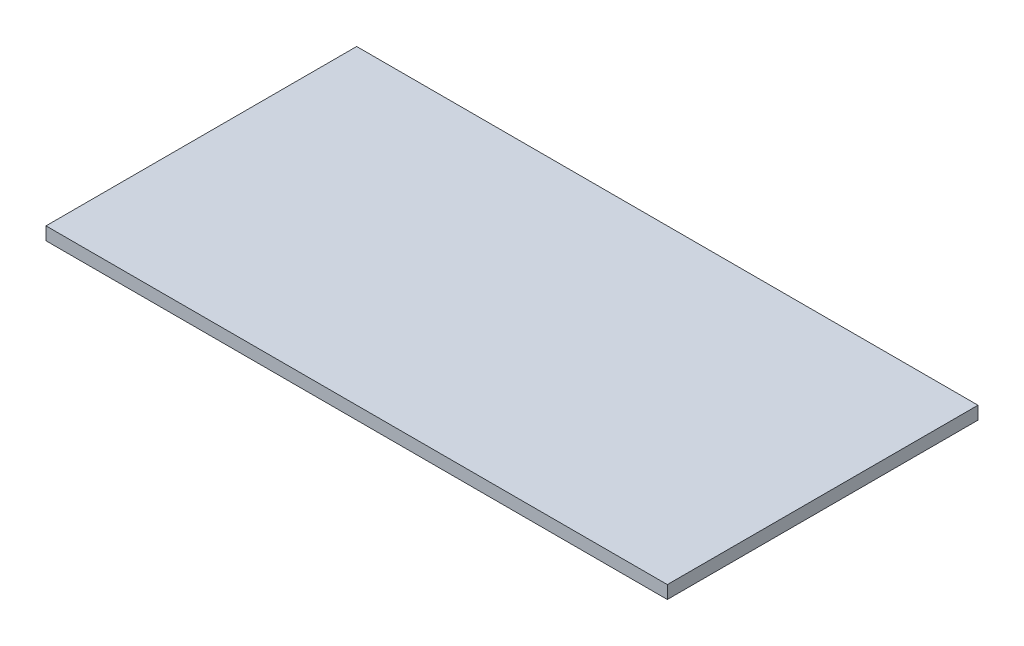
ISO-10303-21;
HEADER;
FILE_DESCRIPTION(('STEP AP214'),'2;1');
FILE_NAME('part.step','',(''),(''),'','','');
FILE_SCHEMA(('AUTOMOTIVE_DESIGN { 1 0 10303 214 1 1 1 1 }'));
ENDSEC;
DATA;
#1=APPLICATION_CONTEXT('core data for automotive mechanical design processes');
#2=APPLICATION_PROTOCOL_DEFINITION('international standard','automotive_design',2000,#1);
#3=PRODUCT_CONTEXT('',#1,'mechanical');
#4=PRODUCT('Part','Part','',(#3));
#5=PRODUCT_RELATED_PRODUCT_CATEGORY('part','',(#4));
#6=PRODUCT_DEFINITION_FORMATION('','',#4);
#7=PRODUCT_DEFINITION_CONTEXT('part definition',#1,'design');
#8=PRODUCT_DEFINITION('design','',#6,#7);
#9=PRODUCT_DEFINITION_SHAPE('','',#8);
#10=(LENGTH_UNIT() NAMED_UNIT(*) SI_UNIT(.MILLI.,.METRE.));
#11=(NAMED_UNIT(*) PLANE_ANGLE_UNIT() SI_UNIT($,.RADIAN.));
#12=(NAMED_UNIT(*) SI_UNIT($,.STERADIAN.) SOLID_ANGLE_UNIT());
#13=UNCERTAINTY_MEASURE_WITH_UNIT(LENGTH_MEASURE(1.E-05),#10,'distance_accuracy_value','');
#14=(GEOMETRIC_REPRESENTATION_CONTEXT(3) GLOBAL_UNCERTAINTY_ASSIGNED_CONTEXT((#13)) GLOBAL_UNIT_ASSIGNED_CONTEXT((#10,
#11,#12)) REPRESENTATION_CONTEXT('',''));
#15=CARTESIAN_POINT('',(0.,0.,0.));
#16=DIRECTION('',(0.,0.,1.));
#17=DIRECTION('',(1.,0.,0.));
#18=AXIS2_PLACEMENT_3D('',#15,#16,#17);
#19=CARTESIAN_POINT('',(0.,3.175,0.));
#20=DIRECTION('',(1.,0.,0.));
#21=DIRECTION('',(0.,0.,-1.));
#22=AXIS2_PLACEMENT_3D('',#19,#20,#21);
#23=PLANE('',#22);
#24=DIRECTION('',(0.,0.,1.));
#25=VECTOR('',#24,1.);
#26=CARTESIAN_POINT('',(0.,0.,0.));
#27=LINE('',#26,#25);
#28=CARTESIAN_POINT('',(0.,0.,-76.2));
#29=VERTEX_POINT('',#28);
#30=CARTESIAN_POINT('',(0.,0.,0.));
#31=VERTEX_POINT('',#30);
#32=EDGE_CURVE('E96',#29,#31,#27,.T.);
#33=ORIENTED_EDGE('',*,*,#32,.T.);
#34=DIRECTION('',(0.,-1.,0.));
#35=VECTOR('',#34,1.);
#36=CARTESIAN_POINT('',(0.,3.175,0.));
#37=LINE('',#36,#35);
#38=CARTESIAN_POINT('',(0.,3.175,0.));
#39=VERTEX_POINT('',#38);
#40=EDGE_CURVE('E11',#39,#31,#37,.T.);
#41=ORIENTED_EDGE('',*,*,#40,.F.);
#42=DIRECTION('',(0.,0.,1.));
#43=VECTOR('',#42,1.);
#44=CARTESIAN_POINT('',(0.,3.175,0.));
#45=LINE('',#44,#43);
#46=CARTESIAN_POINT('',(0.,3.175,-76.2));
#47=VERTEX_POINT('',#46);
#48=EDGE_CURVE('E84',#47,#39,#45,.T.);
#49=ORIENTED_EDGE('',*,*,#48,.F.);
#50=DIRECTION('',(0.,-1.,0.));
#51=VECTOR('',#50,1.);
#52=CARTESIAN_POINT('',(0.,3.175,-76.2));
#53=LINE('',#52,#51);
#54=EDGE_CURVE('E92',#47,#29,#53,.T.);
#55=ORIENTED_EDGE('',*,*,#54,.T.);
#56=EDGE_LOOP('',(#33,#41,#49,#55));
#57=FACE_BOUND('',#56,.T.);
#58=ADVANCED_FACE('F33',(#57),#23,.F.);
#59=CARTESIAN_POINT('',(0.,3.175,0.));
#60=DIRECTION('',(0.,0.,-1.));
#61=DIRECTION('',(-1.,0.,0.));
#62=AXIS2_PLACEMENT_3D('',#59,#60,#61);
#63=PLANE('',#62);
#64=DIRECTION('',(1.,0.,0.));
#65=VECTOR('',#64,1.);
#66=CARTESIAN_POINT('',(0.,0.,0.));
#67=LINE('',#66,#65);
#68=CARTESIAN_POINT('',(152.4,0.,0.));
#69=VERTEX_POINT('',#68);
#70=EDGE_CURVE('E88',#31,#69,#67,.T.);
#71=ORIENTED_EDGE('',*,*,#70,.T.);
#72=DIRECTION('',(0.,-1.,0.));
#73=VECTOR('',#72,1.);
#74=CARTESIAN_POINT('',(152.4,3.175,0.));
#75=LINE('',#74,#73);
#76=CARTESIAN_POINT('',(152.4,3.175,0.));
#77=VERTEX_POINT('',#76);
#78=EDGE_CURVE('E41',#77,#69,#75,.T.);
#79=ORIENTED_EDGE('',*,*,#78,.F.);
#80=DIRECTION('',(1.,0.,0.));
#81=VECTOR('',#80,1.);
#82=CARTESIAN_POINT('',(0.,3.175,0.));
#83=LINE('',#82,#81);
#84=EDGE_CURVE('E79',#39,#77,#83,.T.);
#85=ORIENTED_EDGE('',*,*,#84,.F.);
#86=ORIENTED_EDGE('',*,*,#40,.T.);
#87=EDGE_LOOP('',(#71,#79,#85,#86));
#88=FACE_BOUND('',#87,.T.);
#89=ADVANCED_FACE('F87',(#88),#63,.F.);
#90=CARTESIAN_POINT('',(152.4,3.175,0.));
#91=DIRECTION('',(-1.,0.,0.));
#92=DIRECTION('',(0.,0.,1.));
#93=AXIS2_PLACEMENT_3D('',#90,#91,#92);
#94=PLANE('',#93);
#95=DIRECTION('',(0.,0.,-1.));
#96=VECTOR('',#95,1.);
#97=CARTESIAN_POINT('',(152.4,0.,0.));
#98=LINE('',#97,#96);
#99=CARTESIAN_POINT('',(152.4,0.,-76.2));
#100=VERTEX_POINT('',#99);
#101=EDGE_CURVE('E66',#69,#100,#98,.T.);
#102=ORIENTED_EDGE('',*,*,#101,.T.);
#103=DIRECTION('',(0.,-1.,0.));
#104=VECTOR('',#103,1.);
#105=CARTESIAN_POINT('',(152.4,3.175,-76.2));
#106=LINE('',#105,#104);
#107=CARTESIAN_POINT('',(152.4,3.175,-76.2));
#108=VERTEX_POINT('',#107);
#109=EDGE_CURVE('E89',#108,#100,#106,.T.);
#110=ORIENTED_EDGE('',*,*,#109,.F.);
#111=DIRECTION('',(0.,0.,-1.));
#112=VECTOR('',#111,1.);
#113=CARTESIAN_POINT('',(152.4,3.175,0.));
#114=LINE('',#113,#112);
#115=EDGE_CURVE('E82',#77,#108,#114,.T.);
#116=ORIENTED_EDGE('',*,*,#115,.F.);
#117=ORIENTED_EDGE('',*,*,#78,.T.);
#118=EDGE_LOOP('',(#102,#110,#116,#117));
#119=FACE_BOUND('',#118,.T.);
#120=ADVANCED_FACE('F90',(#119),#94,.F.);
#121=CARTESIAN_POINT('',(0.,3.175,-76.2));
#122=DIRECTION('',(0.,0.,1.));
#123=DIRECTION('',(1.,0.,0.));
#124=AXIS2_PLACEMENT_3D('',#121,#122,#123);
#125=PLANE('',#124);
#126=DIRECTION('',(-1.,0.,0.));
#127=VECTOR('',#126,1.);
#128=CARTESIAN_POINT('',(0.,0.,-76.2));
#129=LINE('',#128,#127);
#130=EDGE_CURVE('E72',#100,#29,#129,.T.);
#131=ORIENTED_EDGE('',*,*,#130,.T.);
#132=ORIENTED_EDGE('',*,*,#54,.F.);
#133=DIRECTION('',(-1.,0.,0.));
#134=VECTOR('',#133,1.);
#135=CARTESIAN_POINT('',(0.,3.175,-76.2));
#136=LINE('',#135,#134);
#137=EDGE_CURVE('E49',#108,#47,#136,.T.);
#138=ORIENTED_EDGE('',*,*,#137,.F.);
#139=ORIENTED_EDGE('',*,*,#109,.T.);
#140=EDGE_LOOP('',(#131,#132,#138,#139));
#141=FACE_BOUND('',#140,.T.);
#142=ADVANCED_FACE('F103',(#141),#125,.F.);
#143=CARTESIAN_POINT('',(0.,3.175,0.));
#144=DIRECTION('',(0.,-1.,0.));
#145=DIRECTION('',(0.,0.,-1.));
#146=AXIS2_PLACEMENT_3D('',#143,#144,#145);
#147=PLANE('',#146);
#148=ORIENTED_EDGE('',*,*,#48,.T.);
#149=ORIENTED_EDGE('',*,*,#84,.T.);
#150=ORIENTED_EDGE('',*,*,#115,.T.);
#151=ORIENTED_EDGE('',*,*,#137,.T.);
#152=EDGE_LOOP('',(#148,#149,#150,#151));
#153=FACE_BOUND('',#152,.T.);
#154=ADVANCED_FACE('F80',(#153),#147,.F.);
#155=CARTESIAN_POINT('',(0.,0.,0.));
#156=DIRECTION('',(0.,-1.,0.));
#157=DIRECTION('',(0.,0.,-1.));
#158=AXIS2_PLACEMENT_3D('',#155,#156,#157);
#159=PLANE('',#158);
#160=ORIENTED_EDGE('',*,*,#32,.F.);
#161=ORIENTED_EDGE('',*,*,#130,.F.);
#162=ORIENTED_EDGE('',*,*,#101,.F.);
#163=ORIENTED_EDGE('',*,*,#70,.F.);
#164=EDGE_LOOP('',(#160,#161,#162,#163));
#165=FACE_BOUND('',#164,.T.);
#166=ADVANCED_FACE('F106',(#165),#159,.T.);
#167=CLOSED_SHELL('',(#58,#89,#120,#142,#154,#166));
#168=MANIFOLD_SOLID_BREP('B2',#167);
#169=ADVANCED_BREP_SHAPE_REPRESENTATION('',(#18,#168),#14);
#170=SHAPE_DEFINITION_REPRESENTATION(#9,#169);
ENDSEC;
END-ISO-10303-21;
